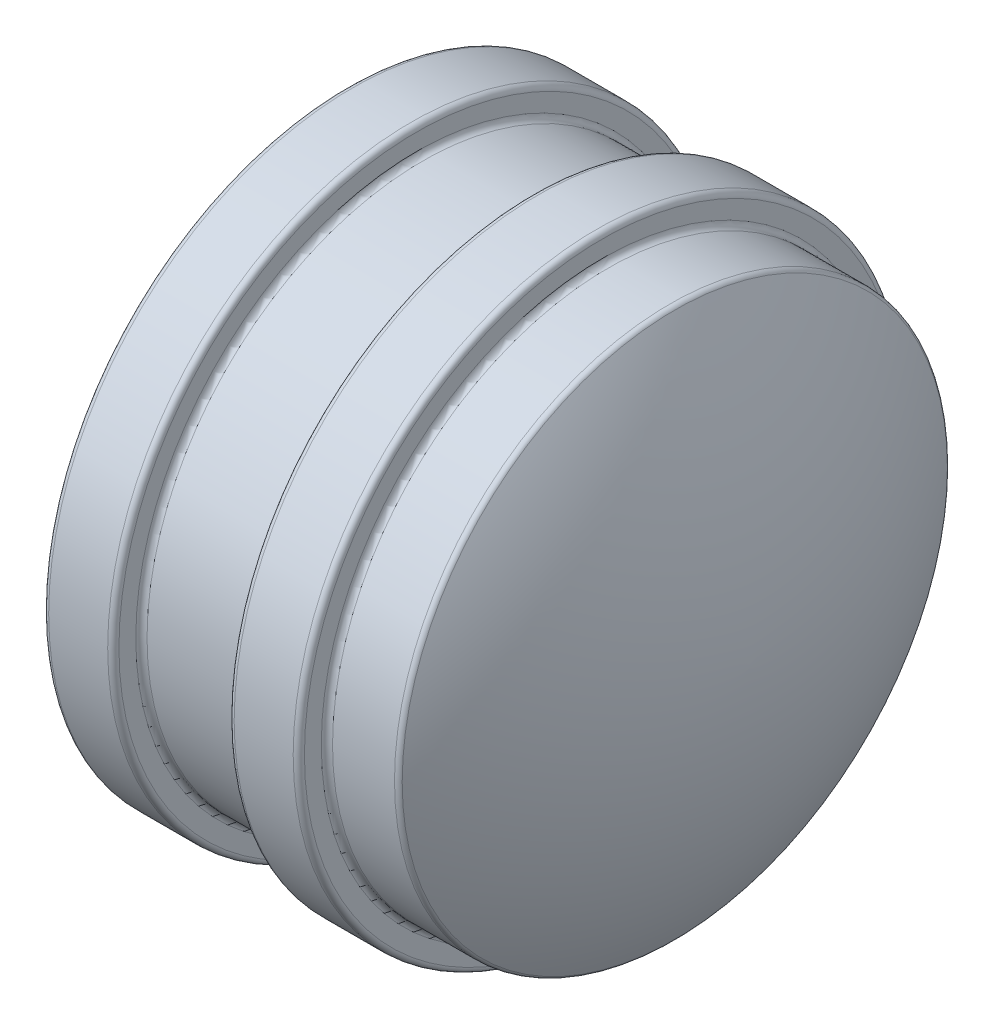
ISO-10303-21;
HEADER;
FILE_DESCRIPTION(('STEP AP214'),'2;1');
FILE_NAME('part.step','',(''),(''),'','','');
FILE_SCHEMA(('AUTOMOTIVE_DESIGN { 1 0 10303 214 1 1 1 1 }'));
ENDSEC;
DATA;
#1=APPLICATION_CONTEXT('core data for automotive mechanical design processes');
#2=APPLICATION_PROTOCOL_DEFINITION('international standard','automotive_design',2000,#1);
#3=PRODUCT_CONTEXT('',#1,'mechanical');
#4=PRODUCT('Part','Part','',(#3));
#5=PRODUCT_RELATED_PRODUCT_CATEGORY('part','',(#4));
#6=PRODUCT_DEFINITION_FORMATION('','',#4);
#7=PRODUCT_DEFINITION_CONTEXT('part definition',#1,'design');
#8=PRODUCT_DEFINITION('design','',#6,#7);
#9=PRODUCT_DEFINITION_SHAPE('','',#8);
#10=(LENGTH_UNIT() NAMED_UNIT(*) SI_UNIT(.MILLI.,.METRE.));
#11=(NAMED_UNIT(*) PLANE_ANGLE_UNIT() SI_UNIT($,.RADIAN.));
#12=(NAMED_UNIT(*) SI_UNIT($,.STERADIAN.) SOLID_ANGLE_UNIT());
#13=UNCERTAINTY_MEASURE_WITH_UNIT(LENGTH_MEASURE(1.E-05),#10,'distance_accuracy_value','');
#14=(GEOMETRIC_REPRESENTATION_CONTEXT(3) GLOBAL_UNCERTAINTY_ASSIGNED_CONTEXT((#13)) GLOBAL_UNIT_ASSIGNED_CONTEXT((#10,
#11,#12)) REPRESENTATION_CONTEXT('',''));
#15=CARTESIAN_POINT('',(0.,0.,0.));
#16=DIRECTION('',(0.,0.,1.));
#17=DIRECTION('',(1.,0.,0.));
#18=AXIS2_PLACEMENT_3D('',#15,#16,#17);
#19=CARTESIAN_POINT('',(0.,13.716,0.));
#20=DIRECTION('',(1.,0.,0.));
#21=DIRECTION('',(0.,0.,-1.));
#22=AXIS2_PLACEMENT_3D('',#19,#20,#21);
#23=PLANE('',#22);
#24=CARTESIAN_POINT('',(0.,-7.112,0.));
#25=DIRECTION('',(1.,0.,0.));
#26=DIRECTION('',(0.,0.,-1.));
#27=AXIS2_PLACEMENT_3D('',#24,#25,#26);
#28=CIRCLE('',#27,2.54);
#29=CARTESIAN_POINT('',(0.,-7.112,-2.54000000000005));
#30=VERTEX_POINT('',#29);
#31=EDGE_CURVE('E198',#30,#30,#28,.T.);
#32=ORIENTED_EDGE('',*,*,#31,.T.);
#33=EDGE_LOOP('',(#32));
#34=FACE_BOUND('',#33,.T.);
#35=CARTESIAN_POINT('',(0.,-5.02894342779868,-5.02894342779877));
#36=DIRECTION('',(1.,0.,0.));
#37=DIRECTION('',(0.,0.,-1.));
#38=AXIS2_PLACEMENT_3D('',#35,#36,#37);
#39=CIRCLE('',#38,2.54);
#40=CARTESIAN_POINT('',(0.,-5.02894342779868,-7.56894342779877));
#41=VERTEX_POINT('',#40);
#42=EDGE_CURVE('E200',#41,#41,#39,.T.);
#43=ORIENTED_EDGE('',*,*,#42,.T.);
#44=EDGE_LOOP('',(#43));
#45=FACE_BOUND('',#44,.T.);
#46=CARTESIAN_POINT('',(0.,0.,-7.112));
#47=DIRECTION('',(1.,0.,0.));
#48=DIRECTION('',(0.,0.,-1.));
#49=AXIS2_PLACEMENT_3D('',#46,#47,#48);
#50=CIRCLE('',#49,2.54);
#51=CARTESIAN_POINT('',(0.,0.,-9.652));
#52=VERTEX_POINT('',#51);
#53=EDGE_CURVE('E203',#52,#52,#50,.T.);
#54=ORIENTED_EDGE('',*,*,#53,.T.);
#55=EDGE_LOOP('',(#54));
#56=FACE_BOUND('',#55,.T.);
#57=CARTESIAN_POINT('',(0.,0.,0.));
#58=DIRECTION('',(1.,0.,0.));
#59=DIRECTION('',(0.,0.,-1.));
#60=AXIS2_PLACEMENT_3D('',#57,#58,#59);
#61=CIRCLE('',#60,2.794);
#62=CARTESIAN_POINT('',(0.,0.,-2.794));
#63=VERTEX_POINT('',#62);
#64=EDGE_CURVE('E206',#63,#63,#61,.T.);
#65=ORIENTED_EDGE('',*,*,#64,.T.);
#66=EDGE_LOOP('',(#65));
#67=FACE_BOUND('',#66,.T.);
#68=CARTESIAN_POINT('',(0.,-5.02894342779875,5.0289434277987));
#69=DIRECTION('',(1.,0.,0.));
#70=DIRECTION('',(0.,0.,-1.));
#71=AXIS2_PLACEMENT_3D('',#68,#69,#70);
#72=CIRCLE('',#71,2.54);
#73=CARTESIAN_POINT('',(0.,-5.02894342779875,2.4889434277987));
#74=VERTEX_POINT('',#73);
#75=EDGE_CURVE('E209',#74,#74,#72,.T.);
#76=ORIENTED_EDGE('',*,*,#75,.T.);
#77=EDGE_LOOP('',(#76));
#78=FACE_BOUND('',#77,.T.);
#79=CARTESIAN_POINT('',(0.,0.,7.112));
#80=DIRECTION('',(1.,0.,0.));
#81=DIRECTION('',(0.,0.,-1.));
#82=AXIS2_PLACEMENT_3D('',#79,#80,#81);
#83=CIRCLE('',#82,2.54);
#84=CARTESIAN_POINT('',(0.,0.,4.572));
#85=VERTEX_POINT('',#84);
#86=EDGE_CURVE('E212',#85,#85,#83,.T.);
#87=ORIENTED_EDGE('',*,*,#86,.T.);
#88=EDGE_LOOP('',(#87));
#89=FACE_BOUND('',#88,.T.);
#90=CARTESIAN_POINT('',(0.,5.02894342779872,5.02894342779874));
#91=DIRECTION('',(1.,0.,0.));
#92=DIRECTION('',(0.,0.,-1.));
#93=AXIS2_PLACEMENT_3D('',#90,#91,#92);
#94=CIRCLE('',#93,2.54);
#95=CARTESIAN_POINT('',(0.,5.02894342779872,2.48894342779874));
#96=VERTEX_POINT('',#95);
#97=EDGE_CURVE('E215',#96,#96,#94,.T.);
#98=ORIENTED_EDGE('',*,*,#97,.T.);
#99=EDGE_LOOP('',(#98));
#100=FACE_BOUND('',#99,.T.);
#101=CARTESIAN_POINT('',(0.,7.112,0.));
#102=DIRECTION('',(1.,0.,0.));
#103=DIRECTION('',(0.,0.,-1.));
#104=AXIS2_PLACEMENT_3D('',#101,#102,#103);
#105=CIRCLE('',#104,2.54);
#106=CARTESIAN_POINT('',(0.,7.112,-2.54));
#107=VERTEX_POINT('',#106);
#108=EDGE_CURVE('E175',#107,#107,#105,.T.);
#109=ORIENTED_EDGE('',*,*,#108,.T.);
#110=EDGE_LOOP('',(#109));
#111=FACE_BOUND('',#110,.T.);
#112=CARTESIAN_POINT('',(0.,5.02894342779879,-5.02894342779866));
#113=DIRECTION('',(1.,0.,0.));
#114=DIRECTION('',(0.,0.,-1.));
#115=AXIS2_PLACEMENT_3D('',#112,#113,#114);
#116=CIRCLE('',#115,2.54);
#117=CARTESIAN_POINT('',(0.,5.02894342779879,-7.56894342779866));
#118=VERTEX_POINT('',#117);
#119=EDGE_CURVE('E219',#118,#118,#116,.T.);
#120=ORIENTED_EDGE('',*,*,#119,.T.);
#121=EDGE_LOOP('',(#120));
#122=FACE_BOUND('',#121,.T.);
#123=CARTESIAN_POINT('',(0.,0.,0.));
#124=DIRECTION('',(1.,0.,0.));
#125=DIRECTION('',(0.,0.,-1.));
#126=AXIS2_PLACEMENT_3D('',#123,#124,#125);
#127=CIRCLE('',#126,13.462);
#128=CARTESIAN_POINT('',(0.,0.,-13.462));
#129=VERTEX_POINT('',#128);
#130=EDGE_CURVE('E279',#129,#129,#127,.F.);
#131=ORIENTED_EDGE('',*,*,#130,.T.);
#132=EDGE_LOOP('',(#131));
#133=FACE_BOUND('',#132,.T.);
#134=ADVANCED_FACE('F31',(#34,#45,#56,#67,#78,#89,#100,#111,#122,#133),#23,.F.);
#135=CARTESIAN_POINT('',(0.,0.,0.));
#136=DIRECTION('',(-1.,0.,0.));
#137=DIRECTION('',(0.,0.,1.));
#138=AXIS2_PLACEMENT_3D('',#135,#136,#137);
#139=CYLINDRICAL_SURFACE('',#138,13.716);
#140=CARTESIAN_POINT('',(2.921,0.,0.));
#141=DIRECTION('',(-1.,0.,0.));
#142=DIRECTION('',(0.,0.,1.));
#143=AXIS2_PLACEMENT_3D('',#140,#141,#142);
#144=CIRCLE('',#143,13.716);
#145=CARTESIAN_POINT('',(2.921,0.,13.716));
#146=VERTEX_POINT('',#145);
#147=EDGE_CURVE('E282',#146,#146,#144,.T.);
#148=ORIENTED_EDGE('',*,*,#147,.T.);
#149=EDGE_LOOP('',(#148));
#150=FACE_BOUND('',#149,.T.);
#151=CARTESIAN_POINT('',(0.25399999999999,0.,0.));
#152=DIRECTION('',(1.,0.,0.));
#153=DIRECTION('',(0.,0.,-1.));
#154=AXIS2_PLACEMENT_3D('',#151,#152,#153);
#155=CIRCLE('',#154,13.716);
#156=CARTESIAN_POINT('',(0.25399999999999,0.,-13.716));
#157=VERTEX_POINT('',#156);
#158=EDGE_CURVE('E285',#157,#157,#155,.T.);
#159=ORIENTED_EDGE('',*,*,#158,.T.);
#160=EDGE_LOOP('',(#159));
#161=FACE_BOUND('',#160,.T.);
#162=ADVANCED_FACE('F60',(#150,#161),#139,.T.);
#163=CARTESIAN_POINT('',(3.175,12.446,0.));
#164=DIRECTION('',(-1.,0.,0.));
#165=DIRECTION('',(0.,0.,1.));
#166=AXIS2_PLACEMENT_3D('',#163,#164,#165);
#167=PLANE('',#166);
#168=CARTESIAN_POINT('',(3.175,0.,0.));
#169=DIRECTION('',(-1.,0.,0.));
#170=DIRECTION('',(0.,0.,1.));
#171=AXIS2_PLACEMENT_3D('',#168,#169,#170);
#172=CIRCLE('',#171,12.7);
#173=CARTESIAN_POINT('',(3.175,0.,12.7));
#174=VERTEX_POINT('',#173);
#175=EDGE_CURVE('E288',#174,#174,#172,.T.);
#176=ORIENTED_EDGE('',*,*,#175,.T.);
#177=EDGE_LOOP('',(#176));
#178=FACE_BOUND('',#177,.T.);
#179=CARTESIAN_POINT('',(3.175,0.,0.));
#180=DIRECTION('',(-1.,0.,0.));
#181=DIRECTION('',(0.,0.,1.));
#182=AXIS2_PLACEMENT_3D('',#179,#180,#181);
#183=CIRCLE('',#182,13.462);
#184=CARTESIAN_POINT('',(3.175,0.,13.462));
#185=VERTEX_POINT('',#184);
#186=EDGE_CURVE('E291',#185,#185,#183,.F.);
#187=ORIENTED_EDGE('',*,*,#186,.T.);
#188=EDGE_LOOP('',(#187));
#189=FACE_BOUND('',#188,.T.);
#190=ADVANCED_FACE('F66',(#178,#189),#167,.F.);
#191=CARTESIAN_POINT('',(0.,0.,0.));
#192=DIRECTION('',(-1.,0.,0.));
#193=DIRECTION('',(0.,0.,1.));
#194=AXIS2_PLACEMENT_3D('',#191,#192,#193);
#195=CYLINDRICAL_SURFACE('',#194,12.446);
#196=CARTESIAN_POINT('',(8.128,0.,0.));
#197=DIRECTION('',(1.,0.,0.));
#198=DIRECTION('',(0.,0.,-1.));
#199=AXIS2_PLACEMENT_3D('',#196,#197,#198);
#200=CIRCLE('',#199,12.446);
#201=CARTESIAN_POINT('',(8.128,0.,-12.446));
#202=VERTEX_POINT('',#201);
#203=EDGE_CURVE('E294',#202,#202,#200,.F.);
#204=ORIENTED_EDGE('',*,*,#203,.T.);
#205=EDGE_LOOP('',(#204));
#206=FACE_BOUND('',#205,.T.);
#207=CARTESIAN_POINT('',(3.429,0.,0.));
#208=DIRECTION('',(-1.,0.,0.));
#209=DIRECTION('',(0.,0.,1.));
#210=AXIS2_PLACEMENT_3D('',#207,#208,#209);
#211=CIRCLE('',#210,12.446);
#212=CARTESIAN_POINT('',(3.429,0.,12.446));
#213=VERTEX_POINT('',#212);
#214=EDGE_CURVE('E297',#213,#213,#211,.F.);
#215=ORIENTED_EDGE('',*,*,#214,.T.);
#216=EDGE_LOOP('',(#215));
#217=FACE_BOUND('',#216,.T.);
#218=ADVANCED_FACE('F348',(#206,#217),#195,.T.);
#219=CARTESIAN_POINT('',(8.382,13.716,0.));
#220=DIRECTION('',(1.,0.,0.));
#221=DIRECTION('',(0.,0.,-1.));
#222=AXIS2_PLACEMENT_3D('',#219,#220,#221);
#223=PLANE('',#222);
#224=CARTESIAN_POINT('',(8.382,0.,0.));
#225=DIRECTION('',(1.,0.,0.));
#226=DIRECTION('',(0.,0.,-1.));
#227=AXIS2_PLACEMENT_3D('',#224,#225,#226);
#228=CIRCLE('',#227,13.462);
#229=CARTESIAN_POINT('',(8.382,0.,-13.462));
#230=VERTEX_POINT('',#229);
#231=EDGE_CURVE('E300',#230,#230,#228,.F.);
#232=ORIENTED_EDGE('',*,*,#231,.T.);
#233=EDGE_LOOP('',(#232));
#234=FACE_BOUND('',#233,.T.);
#235=CARTESIAN_POINT('',(8.382,0.,0.));
#236=DIRECTION('',(1.,0.,0.));
#237=DIRECTION('',(0.,0.,-1.));
#238=AXIS2_PLACEMENT_3D('',#235,#236,#237);
#239=CIRCLE('',#238,12.7);
#240=CARTESIAN_POINT('',(8.382,0.,-12.7));
#241=VERTEX_POINT('',#240);
#242=EDGE_CURVE('E303',#241,#241,#239,.T.);
#243=ORIENTED_EDGE('',*,*,#242,.T.);
#244=EDGE_LOOP('',(#243));
#245=FACE_BOUND('',#244,.T.);
#246=ADVANCED_FACE('F340',(#234,#245),#223,.F.);
#247=CARTESIAN_POINT('',(0.,0.,0.));
#248=DIRECTION('',(-1.,0.,0.));
#249=DIRECTION('',(0.,0.,1.));
#250=AXIS2_PLACEMENT_3D('',#247,#248,#249);
#251=CYLINDRICAL_SURFACE('',#250,13.716);
#252=CARTESIAN_POINT('',(11.303,0.,0.));
#253=DIRECTION('',(-1.,0.,0.));
#254=DIRECTION('',(0.,0.,1.));
#255=AXIS2_PLACEMENT_3D('',#252,#253,#254);
#256=CIRCLE('',#255,13.716);
#257=CARTESIAN_POINT('',(11.303,0.,13.716));
#258=VERTEX_POINT('',#257);
#259=EDGE_CURVE('E306',#258,#258,#256,.T.);
#260=ORIENTED_EDGE('',*,*,#259,.T.);
#261=EDGE_LOOP('',(#260));
#262=FACE_BOUND('',#261,.T.);
#263=CARTESIAN_POINT('',(8.636,0.,0.));
#264=DIRECTION('',(1.,0.,0.));
#265=DIRECTION('',(0.,0.,-1.));
#266=AXIS2_PLACEMENT_3D('',#263,#264,#265);
#267=CIRCLE('',#266,13.716);
#268=CARTESIAN_POINT('',(8.636,0.,-13.716));
#269=VERTEX_POINT('',#268);
#270=EDGE_CURVE('E309',#269,#269,#267,.T.);
#271=ORIENTED_EDGE('',*,*,#270,.T.);
#272=EDGE_LOOP('',(#271));
#273=FACE_BOUND('',#272,.T.);
#274=ADVANCED_FACE('F332',(#262,#273),#251,.T.);
#275=CARTESIAN_POINT('',(11.557,12.446,0.));
#276=DIRECTION('',(-1.,0.,0.));
#277=DIRECTION('',(0.,0.,1.));
#278=AXIS2_PLACEMENT_3D('',#275,#276,#277);
#279=PLANE('',#278);
#280=CARTESIAN_POINT('',(11.557,0.,0.));
#281=DIRECTION('',(-1.,0.,0.));
#282=DIRECTION('',(0.,0.,1.));
#283=AXIS2_PLACEMENT_3D('',#280,#281,#282);
#284=CIRCLE('',#283,12.7);
#285=CARTESIAN_POINT('',(11.557,0.,12.7));
#286=VERTEX_POINT('',#285);
#287=EDGE_CURVE('E312',#286,#286,#284,.T.);
#288=ORIENTED_EDGE('',*,*,#287,.T.);
#289=EDGE_LOOP('',(#288));
#290=FACE_BOUND('',#289,.T.);
#291=CARTESIAN_POINT('',(11.557,0.,0.));
#292=DIRECTION('',(-1.,0.,0.));
#293=DIRECTION('',(0.,0.,1.));
#294=AXIS2_PLACEMENT_3D('',#291,#292,#293);
#295=CIRCLE('',#294,13.462);
#296=CARTESIAN_POINT('',(11.557,0.,13.462));
#297=VERTEX_POINT('',#296);
#298=EDGE_CURVE('E315',#297,#297,#295,.F.);
#299=ORIENTED_EDGE('',*,*,#298,.T.);
#300=EDGE_LOOP('',(#299));
#301=FACE_BOUND('',#300,.T.);
#302=ADVANCED_FACE('F54',(#290,#301),#279,.F.);
#303=CARTESIAN_POINT('',(0.,0.,0.));
#304=DIRECTION('',(-1.,0.,0.));
#305=DIRECTION('',(0.,0.,1.));
#306=AXIS2_PLACEMENT_3D('',#303,#304,#305);
#307=CYLINDRICAL_SURFACE('',#306,12.446);
#308=CARTESIAN_POINT('',(14.6106330774353,0.,0.));
#309=DIRECTION('',(1.,0.,0.));
#310=DIRECTION('',(0.,0.,-1.));
#311=AXIS2_PLACEMENT_3D('',#308,#309,#310);
#312=CIRCLE('',#311,12.446);
#313=CARTESIAN_POINT('',(14.6106330774353,0.,-12.446));
#314=VERTEX_POINT('',#313);
#315=EDGE_CURVE('E320',#314,#314,#312,.F.);
#316=ORIENTED_EDGE('',*,*,#315,.T.);
#317=EDGE_LOOP('',(#316));
#318=FACE_BOUND('',#317,.T.);
#319=CARTESIAN_POINT('',(11.811,0.,0.));
#320=DIRECTION('',(-1.,0.,0.));
#321=DIRECTION('',(0.,0.,1.));
#322=AXIS2_PLACEMENT_3D('',#319,#320,#321);
#323=CIRCLE('',#322,12.446);
#324=CARTESIAN_POINT('',(11.811,0.,12.446));
#325=VERTEX_POINT('',#324);
#326=EDGE_CURVE('E323',#325,#325,#323,.F.);
#327=ORIENTED_EDGE('',*,*,#326,.T.);
#328=EDGE_LOOP('',(#327));
#329=FACE_BOUND('',#328,.T.);
#330=ADVANCED_FACE('F44',(#318,#329),#307,.T.);
#331=CARTESIAN_POINT('',(-7.21180336977641,0.,-0.302101948815966));
#332=DIRECTION('',(0.,-1.,0.));
#333=DIRECTION('',(0.,0.,1.));
#334=AXIS2_PLACEMENT_3D('',#331,#332,#333);
#335=CIRCLE('',#334,25.4);
#336=TRIMMED_CURVE('',#335,(PARAMETER_VALUE(-1.55890226884512)),
(PARAMETER_VALUE(1.55890226884512)),.T.,.PARAMETER.);
#337=CARTESIAN_POINT('',(-7.21180336977641,0.,0.));
#338=DIRECTION('',(-1.,0.,0.));
#339=AXIS1_PLACEMENT('',#337,#338);
#340=SURFACE_OF_REVOLUTION('',#336,#339);
#341=CARTESIAN_POINT('',(14.8310617284172,0.,0.));
#342=DIRECTION('',(-1.,0.,0.));
#343=DIRECTION('',(0.,0.,1.));
#344=AXIS2_PLACEMENT_3D('',#341,#342,#343);
#345=CIRCLE('',#344,12.3182030499881);
#346=CARTESIAN_POINT('',(14.8310617284172,0.,12.3182030499881));
#347=VERTEX_POINT('',#346);
#348=EDGE_CURVE('E318',#347,#347,#345,.F.);
#349=ORIENTED_EDGE('',*,*,#348,.T.);
#350=EDGE_LOOP('',(#349));
#351=FACE_BOUND('',#350,.T.);
#352=CARTESIAN_POINT('',(18.1864,0.,0.));
#353=VERTEX_POINT('',#352);
#354=VERTEX_LOOP('',#353);
#355=FACE_BOUND('',#354,.T.);
#356=ADVANCED_FACE('F41',(#351,#355),#340,.T.);
#357=CARTESIAN_POINT('',(14.6106330774353,0.,0.));
#358=DIRECTION('',(1.,0.,0.));
#359=DIRECTION('',(0.,0.,-1.));
#360=AXIS2_PLACEMENT_3D('',#357,#358,#359);
#361=TOROIDAL_SURFACE('',#360,12.192,0.254);
#362=ORIENTED_EDGE('',*,*,#348,.F.);
#363=EDGE_LOOP('',(#362));
#364=FACE_BOUND('',#363,.T.);
#365=ORIENTED_EDGE('',*,*,#315,.F.);
#366=EDGE_LOOP('',(#365));
#367=FACE_BOUND('',#366,.T.);
#368=ADVANCED_FACE('F43',(#364,#367),#361,.T.);
#369=CARTESIAN_POINT('',(11.811,0.,0.));
#370=DIRECTION('',(-1.,0.,0.));
#371=DIRECTION('',(0.,0.,1.));
#372=AXIS2_PLACEMENT_3D('',#369,#370,#371);
#373=TOROIDAL_SURFACE('',#372,12.7,0.254);
#374=ORIENTED_EDGE('',*,*,#326,.F.);
#375=EDGE_LOOP('',(#374));
#376=FACE_BOUND('',#375,.T.);
#377=ORIENTED_EDGE('',*,*,#287,.F.);
#378=EDGE_LOOP('',(#377));
#379=FACE_BOUND('',#378,.T.);
#380=ADVANCED_FACE('F51',(#376,#379),#373,.F.);
#381=CARTESIAN_POINT('',(11.303,0.,0.));
#382=DIRECTION('',(-1.,0.,0.));
#383=DIRECTION('',(0.,0.,1.));
#384=AXIS2_PLACEMENT_3D('',#381,#382,#383);
#385=TOROIDAL_SURFACE('',#384,13.462,0.254);
#386=ORIENTED_EDGE('',*,*,#298,.F.);
#387=EDGE_LOOP('',(#386));
#388=FACE_BOUND('',#387,.T.);
#389=ORIENTED_EDGE('',*,*,#259,.F.);
#390=EDGE_LOOP('',(#389));
#391=FACE_BOUND('',#390,.T.);
#392=ADVANCED_FACE('F75',(#388,#391),#385,.T.);
#393=CARTESIAN_POINT('',(8.636,0.,0.));
#394=DIRECTION('',(1.,0.,0.));
#395=DIRECTION('',(0.,0.,-1.));
#396=AXIS2_PLACEMENT_3D('',#393,#394,#395);
#397=TOROIDAL_SURFACE('',#396,13.462,0.254);
#398=ORIENTED_EDGE('',*,*,#270,.F.);
#399=EDGE_LOOP('',(#398));
#400=FACE_BOUND('',#399,.T.);
#401=ORIENTED_EDGE('',*,*,#231,.F.);
#402=EDGE_LOOP('',(#401));
#403=FACE_BOUND('',#402,.T.);
#404=ADVANCED_FACE('F79',(#400,#403),#397,.T.);
#405=CARTESIAN_POINT('',(8.128,0.,0.));
#406=DIRECTION('',(1.,0.,0.));
#407=DIRECTION('',(0.,0.,-1.));
#408=AXIS2_PLACEMENT_3D('',#405,#406,#407);
#409=TOROIDAL_SURFACE('',#408,12.7,0.254);
#410=ORIENTED_EDGE('',*,*,#242,.F.);
#411=EDGE_LOOP('',(#410));
#412=FACE_BOUND('',#411,.T.);
#413=ORIENTED_EDGE('',*,*,#203,.F.);
#414=EDGE_LOOP('',(#413));
#415=FACE_BOUND('',#414,.T.);
#416=ADVANCED_FACE('F83',(#412,#415),#409,.F.);
#417=CARTESIAN_POINT('',(3.429,0.,0.));
#418=DIRECTION('',(-1.,0.,0.));
#419=DIRECTION('',(0.,0.,1.));
#420=AXIS2_PLACEMENT_3D('',#417,#418,#419);
#421=TOROIDAL_SURFACE('',#420,12.7,0.254);
#422=ORIENTED_EDGE('',*,*,#214,.F.);
#423=EDGE_LOOP('',(#422));
#424=FACE_BOUND('',#423,.T.);
#425=ORIENTED_EDGE('',*,*,#175,.F.);
#426=EDGE_LOOP('',(#425));
#427=FACE_BOUND('',#426,.T.);
#428=ADVANCED_FACE('F87',(#424,#427),#421,.F.);
#429=CARTESIAN_POINT('',(2.921,0.,0.));
#430=DIRECTION('',(-1.,0.,0.));
#431=DIRECTION('',(0.,0.,1.));
#432=AXIS2_PLACEMENT_3D('',#429,#430,#431);
#433=TOROIDAL_SURFACE('',#432,13.462,0.254);
#434=ORIENTED_EDGE('',*,*,#186,.F.);
#435=EDGE_LOOP('',(#434));
#436=FACE_BOUND('',#435,.T.);
#437=ORIENTED_EDGE('',*,*,#147,.F.);
#438=EDGE_LOOP('',(#437));
#439=FACE_BOUND('',#438,.T.);
#440=ADVANCED_FACE('F91',(#436,#439),#433,.T.);
#441=CARTESIAN_POINT('',(0.25399999999999,0.,0.));
#442=DIRECTION('',(1.,0.,0.));
#443=DIRECTION('',(0.,0.,-1.));
#444=AXIS2_PLACEMENT_3D('',#441,#442,#443);
#445=TOROIDAL_SURFACE('',#444,13.462,0.254);
#446=ORIENTED_EDGE('',*,*,#158,.F.);
#447=EDGE_LOOP('',(#446));
#448=FACE_BOUND('',#447,.T.);
#449=ORIENTED_EDGE('',*,*,#130,.F.);
#450=EDGE_LOOP('',(#449));
#451=FACE_BOUND('',#450,.T.);
#452=ADVANCED_FACE('F95',(#448,#451),#445,.T.);
#453=CARTESIAN_POINT('',(6.35,0.,0.));
#454=DIRECTION('',(-1.,0.,0.));
#455=DIRECTION('',(0.,0.,1.));
#456=AXIS2_PLACEMENT_3D('',#453,#454,#455);
#457=CYLINDRICAL_SURFACE('',#456,2.54);
#458=CARTESIAN_POINT('',(0.253999999999989,0.,0.));
#459=DIRECTION('',(1.,0.,0.));
#460=DIRECTION('',(0.,0.,-1.));
#461=AXIS2_PLACEMENT_3D('',#458,#459,#460);
#462=CIRCLE('',#461,2.54);
#463=CARTESIAN_POINT('',(0.253999999999989,0.,-2.54));
#464=VERTEX_POINT('',#463);
#465=EDGE_CURVE('E189',#464,#464,#462,.F.);
#466=ORIENTED_EDGE('',*,*,#465,.T.);
#467=EDGE_LOOP('',(#466));
#468=FACE_BOUND('',#467,.T.);
#469=CARTESIAN_POINT('',(5.08,0.,0.));
#470=DIRECTION('',(-1.,0.,0.));
#471=DIRECTION('',(0.,0.,1.));
#472=AXIS2_PLACEMENT_3D('',#469,#470,#471);
#473=CIRCLE('',#472,2.54);
#474=CARTESIAN_POINT('',(5.08,0.,2.54));
#475=VERTEX_POINT('',#474);
#476=EDGE_CURVE('E249',#475,#475,#473,.F.);
#477=ORIENTED_EDGE('',*,*,#476,.T.);
#478=EDGE_LOOP('',(#477));
#479=FACE_BOUND('',#478,.T.);
#480=ADVANCED_FACE('F99',(#468,#479),#457,.F.);
#481=CARTESIAN_POINT('',(6.35,0.,0.));
#482=DIRECTION('',(-1.,0.,0.));
#483=DIRECTION('',(0.,0.,1.));
#484=AXIS2_PLACEMENT_3D('',#481,#482,#483);
#485=PLANE('',#484);
#486=CARTESIAN_POINT('',(6.35,0.,0.));
#487=DIRECTION('',(-1.,0.,0.));
#488=DIRECTION('',(0.,0.,1.));
#489=AXIS2_PLACEMENT_3D('',#486,#487,#488);
#490=CIRCLE('',#489,1.27);
#491=CARTESIAN_POINT('',(6.35,0.,1.27));
#492=VERTEX_POINT('',#491);
#493=EDGE_CURVE('E252',#492,#492,#490,.T.);
#494=ORIENTED_EDGE('',*,*,#493,.T.);
#495=EDGE_LOOP('',(#494));
#496=FACE_BOUND('',#495,.T.);
#497=ADVANCED_FACE('F454',(#496),#485,.T.);
#498=CARTESIAN_POINT('',(6.35,7.112,0.));
#499=DIRECTION('',(-1.,0.,0.));
#500=DIRECTION('',(0.,0.,1.));
#501=AXIS2_PLACEMENT_3D('',#498,#499,#500);
#502=CYLINDRICAL_SURFACE('',#501,2.286);
#503=CARTESIAN_POINT('',(0.253999999999989,7.112,0.));
#504=DIRECTION('',(1.,0.,0.));
#505=DIRECTION('',(0.,0.,-1.));
#506=AXIS2_PLACEMENT_3D('',#503,#504,#505);
#507=CIRCLE('',#506,2.286);
#508=CARTESIAN_POINT('',(0.253999999999989,7.112,-2.286));
#509=VERTEX_POINT('',#508);
#510=EDGE_CURVE('E38',#509,#509,#507,.F.);
#511=ORIENTED_EDGE('',*,*,#510,.T.);
#512=EDGE_LOOP('',(#511));
#513=FACE_BOUND('',#512,.T.);
#514=CARTESIAN_POINT('',(5.08,7.112,0.));
#515=DIRECTION('',(-1.,0.,0.));
#516=DIRECTION('',(0.,0.,1.));
#517=AXIS2_PLACEMENT_3D('',#514,#515,#516);
#518=CIRCLE('',#517,2.286);
#519=CARTESIAN_POINT('',(5.08,7.112,2.286));
#520=VERTEX_POINT('',#519);
#521=EDGE_CURVE('E231',#520,#520,#518,.F.);
#522=ORIENTED_EDGE('',*,*,#521,.T.);
#523=EDGE_LOOP('',(#522));
#524=FACE_BOUND('',#523,.T.);
#525=ADVANCED_FACE('F459',(#513,#524),#502,.F.);
#526=CARTESIAN_POINT('',(6.35,7.112,0.));
#527=DIRECTION('',(-1.,0.,0.));
#528=DIRECTION('',(0.,0.,1.));
#529=AXIS2_PLACEMENT_3D('',#526,#527,#528);
#530=PLANE('',#529);
#531=CARTESIAN_POINT('',(6.35,7.112,0.));
#532=DIRECTION('',(-1.,0.,0.));
#533=DIRECTION('',(0.,0.,1.));
#534=AXIS2_PLACEMENT_3D('',#531,#532,#533);
#535=CIRCLE('',#534,1.016);
#536=CARTESIAN_POINT('',(6.35,7.112,1.016));
#537=VERTEX_POINT('',#536);
#538=EDGE_CURVE('E234',#537,#537,#535,.T.);
#539=ORIENTED_EDGE('',*,*,#538,.T.);
#540=EDGE_LOOP('',(#539));
#541=FACE_BOUND('',#540,.T.);
#542=ADVANCED_FACE('F467',(#541),#530,.T.);
#543=CARTESIAN_POINT('',(6.35,5.02894342779872,5.02894342779874));
#544=DIRECTION('',(-1.,0.,0.));
#545=DIRECTION('',(0.,0.,1.));
#546=AXIS2_PLACEMENT_3D('',#543,#544,#545);
#547=CYLINDRICAL_SURFACE('',#546,2.286);
#548=CARTESIAN_POINT('',(0.253999999999989,5.02894342779872,5.02894342779874));
#549=DIRECTION('',(1.,0.,0.));
#550=DIRECTION('',(0.,0.,-1.));
#551=AXIS2_PLACEMENT_3D('',#548,#549,#550);
#552=CIRCLE('',#551,2.286);
#553=CARTESIAN_POINT('',(0.253999999999989,5.02894342779872,2.74294342779874));
#554=VERTEX_POINT('',#553);
#555=EDGE_CURVE('E179',#554,#554,#552,.F.);
#556=ORIENTED_EDGE('',*,*,#555,.T.);
#557=EDGE_LOOP('',(#556));
#558=FACE_BOUND('',#557,.T.);
#559=CARTESIAN_POINT('',(5.08,5.02894342779872,5.02894342779874));
#560=DIRECTION('',(-1.,0.,0.));
#561=DIRECTION('',(0.,0.,1.));
#562=AXIS2_PLACEMENT_3D('',#559,#560,#561);
#563=CIRCLE('',#562,2.286);
#564=CARTESIAN_POINT('',(5.08,5.02894342779872,7.31494342779873));
#565=VERTEX_POINT('',#564);
#566=EDGE_CURVE('E255',#565,#565,#563,.F.);
#567=ORIENTED_EDGE('',*,*,#566,.T.);
#568=EDGE_LOOP('',(#567));
#569=FACE_BOUND('',#568,.T.);
#570=ADVANCED_FACE('F472',(#558,#569),#547,.F.);
#571=CARTESIAN_POINT('',(6.35,5.02894342779872,5.02894342779874));
#572=DIRECTION('',(-1.,0.,0.));
#573=DIRECTION('',(0.,0.,1.));
#574=AXIS2_PLACEMENT_3D('',#571,#572,#573);
#575=PLANE('',#574);
#576=CARTESIAN_POINT('',(6.35,5.02894342779872,5.02894342779874));
#577=DIRECTION('',(-1.,0.,0.));
#578=DIRECTION('',(0.,0.,1.));
#579=AXIS2_PLACEMENT_3D('',#576,#577,#578);
#580=CIRCLE('',#579,1.016);
#581=CARTESIAN_POINT('',(6.35,5.02894342779872,6.04494342779873));
#582=VERTEX_POINT('',#581);
#583=EDGE_CURVE('E258',#582,#582,#580,.T.);
#584=ORIENTED_EDGE('',*,*,#583,.T.);
#585=EDGE_LOOP('',(#584));
#586=FACE_BOUND('',#585,.T.);
#587=ADVANCED_FACE('F480',(#586),#575,.T.);
#588=CARTESIAN_POINT('',(6.35,0.,7.112));
#589=DIRECTION('',(-1.,0.,0.));
#590=DIRECTION('',(0.,0.,1.));
#591=AXIS2_PLACEMENT_3D('',#588,#589,#590);
#592=CYLINDRICAL_SURFACE('',#591,2.286);
#593=CARTESIAN_POINT('',(0.253999999999989,0.,7.112));
#594=DIRECTION('',(1.,0.,0.));
#595=DIRECTION('',(0.,0.,-1.));
#596=AXIS2_PLACEMENT_3D('',#593,#594,#595);
#597=CIRCLE('',#596,2.286);
#598=CARTESIAN_POINT('',(0.253999999999989,0.,4.826));
#599=VERTEX_POINT('',#598);
#600=EDGE_CURVE('E181',#599,#599,#597,.F.);
#601=ORIENTED_EDGE('',*,*,#600,.T.);
#602=EDGE_LOOP('',(#601));
#603=FACE_BOUND('',#602,.T.);
#604=CARTESIAN_POINT('',(5.08,0.,7.112));
#605=DIRECTION('',(-1.,0.,0.));
#606=DIRECTION('',(0.,0.,1.));
#607=AXIS2_PLACEMENT_3D('',#604,#605,#606);
#608=CIRCLE('',#607,2.286);
#609=CARTESIAN_POINT('',(5.08,0.,9.398));
#610=VERTEX_POINT('',#609);
#611=EDGE_CURVE('E261',#610,#610,#608,.F.);
#612=ORIENTED_EDGE('',*,*,#611,.T.);
#613=EDGE_LOOP('',(#612));
#614=FACE_BOUND('',#613,.T.);
#615=ADVANCED_FACE('F485',(#603,#614),#592,.F.);
#616=CARTESIAN_POINT('',(6.35,0.,7.112));
#617=DIRECTION('',(-1.,0.,0.));
#618=DIRECTION('',(0.,0.,1.));
#619=AXIS2_PLACEMENT_3D('',#616,#617,#618);
#620=PLANE('',#619);
#621=CARTESIAN_POINT('',(6.35,0.,7.112));
#622=DIRECTION('',(-1.,0.,0.));
#623=DIRECTION('',(0.,0.,1.));
#624=AXIS2_PLACEMENT_3D('',#621,#622,#623);
#625=CIRCLE('',#624,1.016);
#626=CARTESIAN_POINT('',(6.35,0.,8.128));
#627=VERTEX_POINT('',#626);
#628=EDGE_CURVE('E264',#627,#627,#625,.T.);
#629=ORIENTED_EDGE('',*,*,#628,.T.);
#630=EDGE_LOOP('',(#629));
#631=FACE_BOUND('',#630,.T.);
#632=ADVANCED_FACE('F493',(#631),#620,.T.);
#633=CARTESIAN_POINT('',(6.35,-5.02894342779875,5.0289434277987));
#634=DIRECTION('',(-1.,0.,0.));
#635=DIRECTION('',(0.,0.,1.));
#636=AXIS2_PLACEMENT_3D('',#633,#634,#635);
#637=CYLINDRICAL_SURFACE('',#636,2.286);
#638=CARTESIAN_POINT('',(0.253999999999989,-5.02894342779875,5.0289434277987));
#639=DIRECTION('',(1.,0.,0.));
#640=DIRECTION('',(0.,0.,-1.));
#641=AXIS2_PLACEMENT_3D('',#638,#639,#640);
#642=CIRCLE('',#641,2.286);
#643=CARTESIAN_POINT('',(0.253999999999989,-5.02894342779875,2.7429434277987));
#644=VERTEX_POINT('',#643);
#645=EDGE_CURVE('E186',#644,#644,#642,.F.);
#646=ORIENTED_EDGE('',*,*,#645,.T.);
#647=EDGE_LOOP('',(#646));
#648=FACE_BOUND('',#647,.T.);
#649=CARTESIAN_POINT('',(5.08,-5.02894342779875,5.0289434277987));
#650=DIRECTION('',(-1.,0.,0.));
#651=DIRECTION('',(0.,0.,1.));
#652=AXIS2_PLACEMENT_3D('',#649,#650,#651);
#653=CIRCLE('',#652,2.286);
#654=CARTESIAN_POINT('',(5.08,-5.02894342779875,7.3149434277987));
#655=VERTEX_POINT('',#654);
#656=EDGE_CURVE('E267',#655,#655,#653,.F.);
#657=ORIENTED_EDGE('',*,*,#656,.T.);
#658=EDGE_LOOP('',(#657));
#659=FACE_BOUND('',#658,.T.);
#660=ADVANCED_FACE('F498',(#648,#659),#637,.F.);
#661=CARTESIAN_POINT('',(6.35,-5.02894342779875,5.0289434277987));
#662=DIRECTION('',(-1.,0.,0.));
#663=DIRECTION('',(0.,0.,1.));
#664=AXIS2_PLACEMENT_3D('',#661,#662,#663);
#665=PLANE('',#664);
#666=CARTESIAN_POINT('',(6.35,-5.02894342779875,5.0289434277987));
#667=DIRECTION('',(-1.,0.,0.));
#668=DIRECTION('',(0.,0.,1.));
#669=AXIS2_PLACEMENT_3D('',#666,#667,#668);
#670=CIRCLE('',#669,1.016);
#671=CARTESIAN_POINT('',(6.35,-5.02894342779875,6.0449434277987));
#672=VERTEX_POINT('',#671);
#673=EDGE_CURVE('E270',#672,#672,#670,.T.);
#674=ORIENTED_EDGE('',*,*,#673,.T.);
#675=EDGE_LOOP('',(#674));
#676=FACE_BOUND('',#675,.T.);
#677=ADVANCED_FACE('F506',(#676),#665,.T.);
#678=CARTESIAN_POINT('',(6.35,-7.112,0.));
#679=DIRECTION('',(-1.,0.,0.));
#680=DIRECTION('',(0.,0.,1.));
#681=AXIS2_PLACEMENT_3D('',#678,#679,#680);
#682=CYLINDRICAL_SURFACE('',#681,2.286);
#683=CARTESIAN_POINT('',(0.253999999999989,-7.112,0.));
#684=DIRECTION('',(1.,0.,0.));
#685=DIRECTION('',(0.,0.,-1.));
#686=AXIS2_PLACEMENT_3D('',#683,#684,#685);
#687=CIRCLE('',#686,2.286);
#688=CARTESIAN_POINT('',(0.253999999999989,-7.112,-2.28600000000005));
#689=VERTEX_POINT('',#688);
#690=EDGE_CURVE('E222',#689,#689,#687,.F.);
#691=ORIENTED_EDGE('',*,*,#690,.T.);
#692=EDGE_LOOP('',(#691));
#693=FACE_BOUND('',#692,.T.);
#694=CARTESIAN_POINT('',(5.08,-7.112,0.));
#695=DIRECTION('',(-1.,0.,0.));
#696=DIRECTION('',(0.,0.,1.));
#697=AXIS2_PLACEMENT_3D('',#694,#695,#696);
#698=CIRCLE('',#697,2.286);
#699=CARTESIAN_POINT('',(5.08,-7.112,2.28599999999995));
#700=VERTEX_POINT('',#699);
#701=EDGE_CURVE('E273',#700,#700,#698,.F.);
#702=ORIENTED_EDGE('',*,*,#701,.T.);
#703=EDGE_LOOP('',(#702));
#704=FACE_BOUND('',#703,.T.);
#705=ADVANCED_FACE('F511',(#693,#704),#682,.F.);
#706=CARTESIAN_POINT('',(6.35,-7.112,0.));
#707=DIRECTION('',(-1.,0.,0.));
#708=DIRECTION('',(0.,0.,1.));
#709=AXIS2_PLACEMENT_3D('',#706,#707,#708);
#710=PLANE('',#709);
#711=CARTESIAN_POINT('',(6.35,-7.112,0.));
#712=DIRECTION('',(-1.,0.,0.));
#713=DIRECTION('',(0.,0.,1.));
#714=AXIS2_PLACEMENT_3D('',#711,#712,#713);
#715=CIRCLE('',#714,1.016);
#716=CARTESIAN_POINT('',(6.35,-7.112,1.01599999999995));
#717=VERTEX_POINT('',#716);
#718=EDGE_CURVE('E276',#717,#717,#715,.T.);
#719=ORIENTED_EDGE('',*,*,#718,.T.);
#720=EDGE_LOOP('',(#719));
#721=FACE_BOUND('',#720,.T.);
#722=ADVANCED_FACE('F519',(#721),#710,.T.);
#723=CARTESIAN_POINT('',(6.35,-5.02894342779868,-5.02894342779877));
#724=DIRECTION('',(-1.,0.,0.));
#725=DIRECTION('',(0.,0.,1.));
#726=AXIS2_PLACEMENT_3D('',#723,#724,#725);
#727=CYLINDRICAL_SURFACE('',#726,2.286);
#728=CARTESIAN_POINT('',(0.253999999999989,-5.02894342779868,-5.02894342779877));
#729=DIRECTION('',(1.,0.,0.));
#730=DIRECTION('',(0.,0.,-1.));
#731=AXIS2_PLACEMENT_3D('',#728,#729,#730);
#732=CIRCLE('',#731,2.286);
#733=CARTESIAN_POINT('',(0.253999999999989,-5.02894342779868,-7.31494342779877));
#734=VERTEX_POINT('',#733);
#735=EDGE_CURVE('E195',#734,#734,#732,.F.);
#736=ORIENTED_EDGE('',*,*,#735,.T.);
#737=EDGE_LOOP('',(#736));
#738=FACE_BOUND('',#737,.T.);
#739=CARTESIAN_POINT('',(5.08,-5.02894342779868,-5.02894342779877));
#740=DIRECTION('',(-1.,0.,0.));
#741=DIRECTION('',(0.,0.,1.));
#742=AXIS2_PLACEMENT_3D('',#739,#740,#741);
#743=CIRCLE('',#742,2.286);
#744=CARTESIAN_POINT('',(5.08,-5.02894342779868,-2.74294342779877));
#745=VERTEX_POINT('',#744);
#746=EDGE_CURVE('E243',#745,#745,#743,.F.);
#747=ORIENTED_EDGE('',*,*,#746,.T.);
#748=EDGE_LOOP('',(#747));
#749=FACE_BOUND('',#748,.T.);
#750=ADVANCED_FACE('F524',(#738,#749),#727,.F.);
#751=CARTESIAN_POINT('',(6.35,-5.02894342779868,-5.02894342779877));
#752=DIRECTION('',(-1.,0.,0.));
#753=DIRECTION('',(0.,0.,1.));
#754=AXIS2_PLACEMENT_3D('',#751,#752,#753);
#755=PLANE('',#754);
#756=CARTESIAN_POINT('',(6.35,-5.02894342779868,-5.02894342779877));
#757=DIRECTION('',(-1.,0.,0.));
#758=DIRECTION('',(0.,0.,1.));
#759=AXIS2_PLACEMENT_3D('',#756,#757,#758);
#760=CIRCLE('',#759,1.016);
#761=CARTESIAN_POINT('',(6.35,-5.02894342779868,-4.01294342779877));
#762=VERTEX_POINT('',#761);
#763=EDGE_CURVE('E246',#762,#762,#760,.T.);
#764=ORIENTED_EDGE('',*,*,#763,.T.);
#765=EDGE_LOOP('',(#764));
#766=FACE_BOUND('',#765,.T.);
#767=ADVANCED_FACE('F532',(#766),#755,.T.);
#768=CARTESIAN_POINT('',(6.35,0.,-7.112));
#769=DIRECTION('',(-1.,0.,0.));
#770=DIRECTION('',(0.,0.,1.));
#771=AXIS2_PLACEMENT_3D('',#768,#769,#770);
#772=CYLINDRICAL_SURFACE('',#771,2.286);
#773=CARTESIAN_POINT('',(0.253999999999989,0.,-7.112));
#774=DIRECTION('',(1.,0.,0.));
#775=DIRECTION('',(0.,0.,-1.));
#776=AXIS2_PLACEMENT_3D('',#773,#774,#775);
#777=CIRCLE('',#776,2.286);
#778=CARTESIAN_POINT('',(0.253999999999989,0.,-9.398));
#779=VERTEX_POINT('',#778);
#780=EDGE_CURVE('E192',#779,#779,#777,.F.);
#781=ORIENTED_EDGE('',*,*,#780,.T.);
#782=EDGE_LOOP('',(#781));
#783=FACE_BOUND('',#782,.T.);
#784=CARTESIAN_POINT('',(5.08,0.,-7.112));
#785=DIRECTION('',(-1.,0.,0.));
#786=DIRECTION('',(0.,0.,1.));
#787=AXIS2_PLACEMENT_3D('',#784,#785,#786);
#788=CIRCLE('',#787,2.286);
#789=CARTESIAN_POINT('',(5.08,0.,-4.826));
#790=VERTEX_POINT('',#789);
#791=EDGE_CURVE('E237',#790,#790,#788,.F.);
#792=ORIENTED_EDGE('',*,*,#791,.T.);
#793=EDGE_LOOP('',(#792));
#794=FACE_BOUND('',#793,.T.);
#795=ADVANCED_FACE('F537',(#783,#794),#772,.F.);
#796=CARTESIAN_POINT('',(6.35,0.,-7.112));
#797=DIRECTION('',(-1.,0.,0.));
#798=DIRECTION('',(0.,0.,1.));
#799=AXIS2_PLACEMENT_3D('',#796,#797,#798);
#800=PLANE('',#799);
#801=CARTESIAN_POINT('',(6.35,0.,-7.112));
#802=DIRECTION('',(-1.,0.,0.));
#803=DIRECTION('',(0.,0.,1.));
#804=AXIS2_PLACEMENT_3D('',#801,#802,#803);
#805=CIRCLE('',#804,1.016);
#806=CARTESIAN_POINT('',(6.35,0.,-6.096));
#807=VERTEX_POINT('',#806);
#808=EDGE_CURVE('E240',#807,#807,#805,.T.);
#809=ORIENTED_EDGE('',*,*,#808,.T.);
#810=EDGE_LOOP('',(#809));
#811=FACE_BOUND('',#810,.T.);
#812=ADVANCED_FACE('F545',(#811),#800,.T.);
#813=CARTESIAN_POINT('',(6.35,5.02894342779879,-5.02894342779866));
#814=DIRECTION('',(-1.,0.,0.));
#815=DIRECTION('',(0.,0.,1.));
#816=AXIS2_PLACEMENT_3D('',#813,#814,#815);
#817=CYLINDRICAL_SURFACE('',#816,2.286);
#818=CARTESIAN_POINT('',(0.253999999999989,5.02894342779879,-5.02894342779866));
#819=DIRECTION('',(1.,0.,0.));
#820=DIRECTION('',(0.,0.,-1.));
#821=AXIS2_PLACEMENT_3D('',#818,#819,#820);
#822=CIRCLE('',#821,2.286);
#823=CARTESIAN_POINT('',(0.253999999999989,5.02894342779879,-7.31494342779866));
#824=VERTEX_POINT('',#823);
#825=EDGE_CURVE('E11',#824,#824,#822,.F.);
#826=ORIENTED_EDGE('',*,*,#825,.T.);
#827=EDGE_LOOP('',(#826));
#828=FACE_BOUND('',#827,.T.);
#829=CARTESIAN_POINT('',(5.08,5.02894342779879,-5.02894342779866));
#830=DIRECTION('',(-1.,0.,0.));
#831=DIRECTION('',(0.,0.,1.));
#832=AXIS2_PLACEMENT_3D('',#829,#830,#831);
#833=CIRCLE('',#832,2.286);
#834=CARTESIAN_POINT('',(5.08,5.02894342779879,-2.74294342779867));
#835=VERTEX_POINT('',#834);
#836=EDGE_CURVE('E225',#835,#835,#833,.F.);
#837=ORIENTED_EDGE('',*,*,#836,.T.);
#838=EDGE_LOOP('',(#837));
#839=FACE_BOUND('',#838,.T.);
#840=ADVANCED_FACE('F550',(#828,#839),#817,.F.);
#841=CARTESIAN_POINT('',(6.35,5.02894342779879,-5.02894342779866));
#842=DIRECTION('',(-1.,0.,0.));
#843=DIRECTION('',(0.,0.,1.));
#844=AXIS2_PLACEMENT_3D('',#841,#842,#843);
#845=PLANE('',#844);
#846=CARTESIAN_POINT('',(6.35,5.02894342779879,-5.02894342779866));
#847=DIRECTION('',(-1.,0.,0.));
#848=DIRECTION('',(0.,0.,1.));
#849=AXIS2_PLACEMENT_3D('',#846,#847,#848);
#850=CIRCLE('',#849,1.016);
#851=CARTESIAN_POINT('',(6.35,5.02894342779879,-4.01294342779867));
#852=VERTEX_POINT('',#851);
#853=EDGE_CURVE('E228',#852,#852,#850,.T.);
#854=ORIENTED_EDGE('',*,*,#853,.T.);
#855=EDGE_LOOP('',(#854));
#856=FACE_BOUND('',#855,.T.);
#857=ADVANCED_FACE('F105',(#856),#845,.T.);
#858=CARTESIAN_POINT('',(5.08,-7.112,0.));
#859=DIRECTION('',(-1.,0.,0.));
#860=DIRECTION('',(0.,0.,1.));
#861=AXIS2_PLACEMENT_3D('',#858,#859,#860);
#862=DEGENERATE_TOROIDAL_SURFACE('',#861,1.016,1.27,.T.);
#863=ORIENTED_EDGE('',*,*,#701,.F.);
#864=EDGE_LOOP('',(#863));
#865=FACE_BOUND('',#864,.T.);
#866=ORIENTED_EDGE('',*,*,#718,.F.);
#867=EDGE_LOOP('',(#866));
#868=FACE_BOUND('',#867,.T.);
#869=ADVANCED_FACE('F101',(#865,#868),#862,.F.);
#870=CARTESIAN_POINT('',(5.08,-5.02894342779875,5.0289434277987));
#871=DIRECTION('',(-1.,0.,0.));
#872=DIRECTION('',(0.,0.,1.));
#873=AXIS2_PLACEMENT_3D('',#870,#871,#872);
#874=DEGENERATE_TOROIDAL_SURFACE('',#873,1.016,1.27,.T.);
#875=ORIENTED_EDGE('',*,*,#656,.F.);
#876=EDGE_LOOP('',(#875));
#877=FACE_BOUND('',#876,.T.);
#878=ORIENTED_EDGE('',*,*,#673,.F.);
#879=EDGE_LOOP('',(#878));
#880=FACE_BOUND('',#879,.T.);
#881=ADVANCED_FACE('F104',(#877,#880),#874,.F.);
#882=CARTESIAN_POINT('',(5.08,0.,7.112));
#883=DIRECTION('',(-1.,0.,0.));
#884=DIRECTION('',(0.,0.,1.));
#885=AXIS2_PLACEMENT_3D('',#882,#883,#884);
#886=DEGENERATE_TOROIDAL_SURFACE('',#885,1.016,1.27,.T.);
#887=ORIENTED_EDGE('',*,*,#611,.F.);
#888=EDGE_LOOP('',(#887));
#889=FACE_BOUND('',#888,.T.);
#890=ORIENTED_EDGE('',*,*,#628,.F.);
#891=EDGE_LOOP('',(#890));
#892=FACE_BOUND('',#891,.T.);
#893=ADVANCED_FACE('F109',(#889,#892),#886,.F.);
#894=CARTESIAN_POINT('',(5.08,5.02894342779872,5.02894342779874));
#895=DIRECTION('',(-1.,0.,0.));
#896=DIRECTION('',(0.,0.,1.));
#897=AXIS2_PLACEMENT_3D('',#894,#895,#896);
#898=DEGENERATE_TOROIDAL_SURFACE('',#897,1.016,1.27,.T.);
#899=ORIENTED_EDGE('',*,*,#566,.F.);
#900=EDGE_LOOP('',(#899));
#901=FACE_BOUND('',#900,.T.);
#902=ORIENTED_EDGE('',*,*,#583,.F.);
#903=EDGE_LOOP('',(#902));
#904=FACE_BOUND('',#903,.T.);
#905=ADVANCED_FACE('F113',(#901,#904),#898,.F.);
#906=CARTESIAN_POINT('',(5.08,0.,0.));
#907=DIRECTION('',(-1.,0.,0.));
#908=DIRECTION('',(0.,0.,1.));
#909=AXIS2_PLACEMENT_3D('',#906,#907,#908);
#910=DEGENERATE_TOROIDAL_SURFACE('',#909,1.27,1.27,.T.);
#911=ORIENTED_EDGE('',*,*,#476,.F.);
#912=EDGE_LOOP('',(#911));
#913=FACE_BOUND('',#912,.T.);
#914=ORIENTED_EDGE('',*,*,#493,.F.);
#915=EDGE_LOOP('',(#914));
#916=FACE_BOUND('',#915,.T.);
#917=ADVANCED_FACE('F117',(#913,#916),#910,.F.);
#918=CARTESIAN_POINT('',(5.08,-5.02894342779868,-5.02894342779877));
#919=DIRECTION('',(-1.,0.,0.));
#920=DIRECTION('',(0.,0.,1.));
#921=AXIS2_PLACEMENT_3D('',#918,#919,#920);
#922=DEGENERATE_TOROIDAL_SURFACE('',#921,1.016,1.27,.T.);
#923=ORIENTED_EDGE('',*,*,#746,.F.);
#924=EDGE_LOOP('',(#923));
#925=FACE_BOUND('',#924,.T.);
#926=ORIENTED_EDGE('',*,*,#763,.F.);
#927=EDGE_LOOP('',(#926));
#928=FACE_BOUND('',#927,.T.);
#929=ADVANCED_FACE('F121',(#925,#928),#922,.F.);
#930=CARTESIAN_POINT('',(5.08,0.,-7.112));
#931=DIRECTION('',(-1.,0.,0.));
#932=DIRECTION('',(0.,0.,1.));
#933=AXIS2_PLACEMENT_3D('',#930,#931,#932);
#934=DEGENERATE_TOROIDAL_SURFACE('',#933,1.016,1.27,.T.);
#935=ORIENTED_EDGE('',*,*,#791,.F.);
#936=EDGE_LOOP('',(#935));
#937=FACE_BOUND('',#936,.T.);
#938=ORIENTED_EDGE('',*,*,#808,.F.);
#939=EDGE_LOOP('',(#938));
#940=FACE_BOUND('',#939,.T.);
#941=ADVANCED_FACE('F125',(#937,#940),#934,.F.);
#942=CARTESIAN_POINT('',(5.08,7.112,0.));
#943=DIRECTION('',(-1.,0.,0.));
#944=DIRECTION('',(0.,0.,1.));
#945=AXIS2_PLACEMENT_3D('',#942,#943,#944);
#946=DEGENERATE_TOROIDAL_SURFACE('',#945,1.016,1.27,.T.);
#947=ORIENTED_EDGE('',*,*,#521,.F.);
#948=EDGE_LOOP('',(#947));
#949=FACE_BOUND('',#948,.T.);
#950=ORIENTED_EDGE('',*,*,#538,.F.);
#951=EDGE_LOOP('',(#950));
#952=FACE_BOUND('',#951,.T.);
#953=ADVANCED_FACE('F129',(#949,#952),#946,.F.);
#954=CARTESIAN_POINT('',(5.08,5.02894342779879,-5.02894342779866));
#955=DIRECTION('',(-1.,0.,0.));
#956=DIRECTION('',(0.,0.,1.));
#957=AXIS2_PLACEMENT_3D('',#954,#955,#956);
#958=DEGENERATE_TOROIDAL_SURFACE('',#957,1.016,1.27,.T.);
#959=ORIENTED_EDGE('',*,*,#836,.F.);
#960=EDGE_LOOP('',(#959));
#961=FACE_BOUND('',#960,.T.);
#962=ORIENTED_EDGE('',*,*,#853,.F.);
#963=EDGE_LOOP('',(#962));
#964=FACE_BOUND('',#963,.T.);
#965=ADVANCED_FACE('F133',(#961,#964),#958,.F.);
#966=CARTESIAN_POINT('',(0.253999999999989,-7.112,0.));
#967=DIRECTION('',(1.,0.,0.));
#968=DIRECTION('',(0.,0.,-1.));
#969=AXIS2_PLACEMENT_3D('',#966,#967,#968);
#970=TOROIDAL_SURFACE('',#969,2.54,0.254);
#971=ORIENTED_EDGE('',*,*,#31,.F.);
#972=EDGE_LOOP('',(#971));
#973=FACE_BOUND('',#972,.T.);
#974=ORIENTED_EDGE('',*,*,#690,.F.);
#975=EDGE_LOOP('',(#974));
#976=FACE_BOUND('',#975,.T.);
#977=ADVANCED_FACE('F137',(#973,#976),#970,.T.);
#978=CARTESIAN_POINT('',(0.253999999999989,-5.02894342779868,-5.02894342779877));
#979=DIRECTION('',(1.,0.,0.));
#980=DIRECTION('',(0.,0.,-1.));
#981=AXIS2_PLACEMENT_3D('',#978,#979,#980);
#982=TOROIDAL_SURFACE('',#981,2.54,0.254);
#983=ORIENTED_EDGE('',*,*,#42,.F.);
#984=EDGE_LOOP('',(#983));
#985=FACE_BOUND('',#984,.T.);
#986=ORIENTED_EDGE('',*,*,#735,.F.);
#987=EDGE_LOOP('',(#986));
#988=FACE_BOUND('',#987,.T.);
#989=ADVANCED_FACE('F141',(#985,#988),#982,.T.);
#990=CARTESIAN_POINT('',(0.253999999999989,0.,-7.112));
#991=DIRECTION('',(1.,0.,0.));
#992=DIRECTION('',(0.,0.,-1.));
#993=AXIS2_PLACEMENT_3D('',#990,#991,#992);
#994=TOROIDAL_SURFACE('',#993,2.54,0.254);
#995=ORIENTED_EDGE('',*,*,#53,.F.);
#996=EDGE_LOOP('',(#995));
#997=FACE_BOUND('',#996,.T.);
#998=ORIENTED_EDGE('',*,*,#780,.F.);
#999=EDGE_LOOP('',(#998));
#1000=FACE_BOUND('',#999,.T.);
#1001=ADVANCED_FACE('F145',(#997,#1000),#994,.T.);
#1002=CARTESIAN_POINT('',(0.253999999999989,0.,0.));
#1003=DIRECTION('',(1.,0.,0.));
#1004=DIRECTION('',(0.,0.,-1.));
#1005=AXIS2_PLACEMENT_3D('',#1002,#1003,#1004);
#1006=TOROIDAL_SURFACE('',#1005,2.794,0.254);
#1007=ORIENTED_EDGE('',*,*,#64,.F.);
#1008=EDGE_LOOP('',(#1007));
#1009=FACE_BOUND('',#1008,.T.);
#1010=ORIENTED_EDGE('',*,*,#465,.F.);
#1011=EDGE_LOOP('',(#1010));
#1012=FACE_BOUND('',#1011,.T.);
#1013=ADVANCED_FACE('F149',(#1009,#1012),#1006,.T.);
#1014=CARTESIAN_POINT('',(0.253999999999989,-5.02894342779875,5.0289434277987));
#1015=DIRECTION('',(1.,0.,0.));
#1016=DIRECTION('',(0.,0.,-1.));
#1017=AXIS2_PLACEMENT_3D('',#1014,#1015,#1016);
#1018=TOROIDAL_SURFACE('',#1017,2.54,0.254);
#1019=ORIENTED_EDGE('',*,*,#75,.F.);
#1020=EDGE_LOOP('',(#1019));
#1021=FACE_BOUND('',#1020,.T.);
#1022=ORIENTED_EDGE('',*,*,#645,.F.);
#1023=EDGE_LOOP('',(#1022));
#1024=FACE_BOUND('',#1023,.T.);
#1025=ADVANCED_FACE('F153',(#1021,#1024),#1018,.T.);
#1026=CARTESIAN_POINT('',(0.253999999999989,0.,7.112));
#1027=DIRECTION('',(1.,0.,0.));
#1028=DIRECTION('',(0.,0.,-1.));
#1029=AXIS2_PLACEMENT_3D('',#1026,#1027,#1028);
#1030=TOROIDAL_SURFACE('',#1029,2.54,0.254);
#1031=ORIENTED_EDGE('',*,*,#86,.F.);
#1032=EDGE_LOOP('',(#1031));
#1033=FACE_BOUND('',#1032,.T.);
#1034=ORIENTED_EDGE('',*,*,#600,.F.);
#1035=EDGE_LOOP('',(#1034));
#1036=FACE_BOUND('',#1035,.T.);
#1037=ADVANCED_FACE('F157',(#1033,#1036),#1030,.T.);
#1038=CARTESIAN_POINT('',(0.253999999999989,5.02894342779872,5.02894342779874));
#1039=DIRECTION('',(1.,0.,0.));
#1040=DIRECTION('',(0.,0.,-1.));
#1041=AXIS2_PLACEMENT_3D('',#1038,#1039,#1040);
#1042=TOROIDAL_SURFACE('',#1041,2.54,0.254);
#1043=ORIENTED_EDGE('',*,*,#97,.F.);
#1044=EDGE_LOOP('',(#1043));
#1045=FACE_BOUND('',#1044,.T.);
#1046=ORIENTED_EDGE('',*,*,#555,.F.);
#1047=EDGE_LOOP('',(#1046));
#1048=FACE_BOUND('',#1047,.T.);
#1049=ADVANCED_FACE('F161',(#1045,#1048),#1042,.T.);
#1050=CARTESIAN_POINT('',(0.253999999999989,7.112,0.));
#1051=DIRECTION('',(1.,0.,0.));
#1052=DIRECTION('',(0.,0.,-1.));
#1053=AXIS2_PLACEMENT_3D('',#1050,#1051,#1052);
#1054=TOROIDAL_SURFACE('',#1053,2.54,0.254);
#1055=ORIENTED_EDGE('',*,*,#108,.F.);
#1056=EDGE_LOOP('',(#1055));
#1057=FACE_BOUND('',#1056,.T.);
#1058=ORIENTED_EDGE('',*,*,#510,.F.);
#1059=EDGE_LOOP('',(#1058));
#1060=FACE_BOUND('',#1059,.T.);
#1061=ADVANCED_FACE('F164',(#1057,#1060),#1054,.T.);
#1062=CARTESIAN_POINT('',(0.253999999999989,5.02894342779879,-5.02894342779866));
#1063=DIRECTION('',(1.,0.,0.));
#1064=DIRECTION('',(0.,0.,-1.));
#1065=AXIS2_PLACEMENT_3D('',#1062,#1063,#1064);
#1066=TOROIDAL_SURFACE('',#1065,2.54,0.254);
#1067=ORIENTED_EDGE('',*,*,#119,.F.);
#1068=EDGE_LOOP('',(#1067));
#1069=FACE_BOUND('',#1068,.T.);
#1070=ORIENTED_EDGE('',*,*,#825,.F.);
#1071=EDGE_LOOP('',(#1070));
#1072=FACE_BOUND('',#1071,.T.);
#1073=ADVANCED_FACE('F33',(#1069,#1072),#1066,.T.);
#1074=CLOSED_SHELL('',(#134,#162,#190,#218,#246,#274,#302,#330,#356,#368,#380,#392,#404,#416,
#428,#440,#452,#480,#497,#525,#542,#570,#587,#615,#632,#660,#677,#705,#722,#750,#767,#795,#812,
#840,#857,#869,#881,#893,#905,#917,#929,#941,#953,#965,#977,#989,#1001,#1013,#1025,#1037,#1049,
#1061,#1073));
#1075=MANIFOLD_SOLID_BREP('B2',#1074);
#1076=ADVANCED_BREP_SHAPE_REPRESENTATION('',(#18,#1075),#14);
#1077=SHAPE_DEFINITION_REPRESENTATION(#9,#1076);
ENDSEC;
END-ISO-10303-21;
